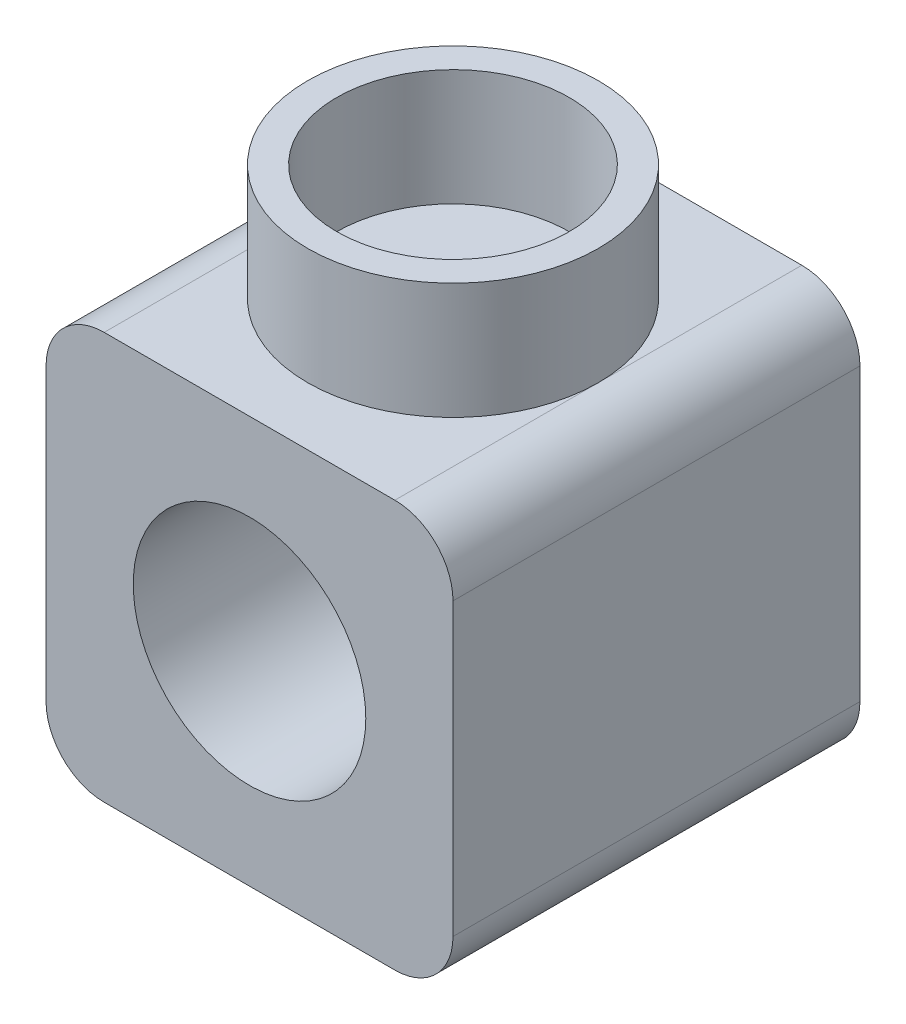
ISO-10303-21;
HEADER;
FILE_DESCRIPTION(('STEP AP214'),'2;1');
FILE_NAME('part.step','',(''),(''),'','','');
FILE_SCHEMA(('AUTOMOTIVE_DESIGN { 1 0 10303 214 1 1 1 1 }'));
ENDSEC;
DATA;
#1=APPLICATION_CONTEXT('core data for automotive mechanical design processes');
#2=APPLICATION_PROTOCOL_DEFINITION('international standard','automotive_design',2000,#1);
#3=PRODUCT_CONTEXT('',#1,'mechanical');
#4=PRODUCT('Part','Part','',(#3));
#5=PRODUCT_RELATED_PRODUCT_CATEGORY('part','',(#4));
#6=PRODUCT_DEFINITION_FORMATION('','',#4);
#7=PRODUCT_DEFINITION_CONTEXT('part definition',#1,'design');
#8=PRODUCT_DEFINITION('design','',#6,#7);
#9=PRODUCT_DEFINITION_SHAPE('','',#8);
#10=(LENGTH_UNIT() NAMED_UNIT(*) SI_UNIT(.MILLI.,.METRE.));
#11=(NAMED_UNIT(*) PLANE_ANGLE_UNIT() SI_UNIT($,.RADIAN.));
#12=(NAMED_UNIT(*) SI_UNIT($,.STERADIAN.) SOLID_ANGLE_UNIT());
#13=UNCERTAINTY_MEASURE_WITH_UNIT(LENGTH_MEASURE(1.E-05),#10,'distance_accuracy_value','');
#14=(GEOMETRIC_REPRESENTATION_CONTEXT(3) GLOBAL_UNCERTAINTY_ASSIGNED_CONTEXT((#13)) GLOBAL_UNIT_ASSIGNED_CONTEXT((#10,
#11,#12)) REPRESENTATION_CONTEXT('',''));
#15=CARTESIAN_POINT('',(0.,0.,0.));
#16=DIRECTION('',(0.,0.,1.));
#17=DIRECTION('',(1.,0.,0.));
#18=AXIS2_PLACEMENT_3D('',#15,#16,#17);
#19=CARTESIAN_POINT('',(-125.,175.,350.));
#20=DIRECTION('',(0.,-1.,0.));
#21=DIRECTION('',(0.,0.,-1.));
#22=AXIS2_PLACEMENT_3D('',#19,#20,#21);
#23=PLANE('',#22);
#24=CARTESIAN_POINT('',(0.,175.,175.));
#25=DIRECTION('',(0.,1.,0.));
#26=DIRECTION('',(0.,0.,1.));
#27=AXIS2_PLACEMENT_3D('',#24,#25,#26);
#28=CIRCLE('',#27,125.);
#29=CARTESIAN_POINT('',(-125.,175.,175.));
#30=VERTEX_POINT('',#29);
#31=CARTESIAN_POINT('',(125.,175.,175.));
#32=VERTEX_POINT('',#31);
#33=EDGE_CURVE('E134',#30,#32,#28,.T.);
#34=ORIENTED_EDGE('',*,*,#33,.F.);
#35=DIRECTION('',(0.,0.,-1.));
#36=VECTOR('',#35,1.);
#37=CARTESIAN_POINT('',(-125.,175.,350.));
#38=LINE('',#37,#36);
#39=CARTESIAN_POINT('',(-125.,175.,350.));
#40=VERTEX_POINT('',#39);
#41=EDGE_CURVE('E132',#40,#30,#38,.T.);
#42=ORIENTED_EDGE('',*,*,#41,.F.);
#43=DIRECTION('',(-1.,0.,0.));
#44=VECTOR('',#43,1.);
#45=CARTESIAN_POINT('',(-125.,175.,350.));
#46=LINE('',#45,#44);
#47=CARTESIAN_POINT('',(125.,175.,350.));
#48=VERTEX_POINT('',#47);
#49=EDGE_CURVE('E117',#48,#40,#46,.T.);
#50=ORIENTED_EDGE('',*,*,#49,.F.);
#51=DIRECTION('',(0.,0.,-1.));
#52=VECTOR('',#51,1.);
#53=CARTESIAN_POINT('',(125.,175.,350.));
#54=LINE('',#53,#52);
#55=EDGE_CURVE('E168',#48,#32,#54,.T.);
#56=ORIENTED_EDGE('',*,*,#55,.T.);
#57=EDGE_LOOP('',(#34,#42,#50,#56));
#58=FACE_BOUND('',#57,.T.);
#59=ADVANCED_FACE('F39',(#58),#23,.F.);
#60=CARTESIAN_POINT('',(-125.,-125.,350.));
#61=DIRECTION('',(0.,0.,-1.));
#62=DIRECTION('',(-1.,0.,0.));
#63=AXIS2_PLACEMENT_3D('',#60,#61,#62);
#64=PLANE('',#63);
#65=CARTESIAN_POINT('',(-125.,-125.,350.));
#66=DIRECTION('',(0.,0.,1.));
#67=DIRECTION('',(-1.,0.,0.));
#68=AXIS2_PLACEMENT_3D('',#65,#66,#67);
#69=CIRCLE('',#68,50.);
#70=CARTESIAN_POINT('',(-175.,-125.,350.));
#71=VERTEX_POINT('',#70);
#72=CARTESIAN_POINT('',(-125.,-175.,350.));
#73=VERTEX_POINT('',#72);
#74=EDGE_CURVE('E165',#71,#73,#69,.T.);
#75=ORIENTED_EDGE('',*,*,#74,.T.);
#76=DIRECTION('',(1.,0.,0.));
#77=VECTOR('',#76,1.);
#78=CARTESIAN_POINT('',(-125.,-175.,350.));
#79=LINE('',#78,#77);
#80=CARTESIAN_POINT('',(125.,-175.,350.));
#81=VERTEX_POINT('',#80);
#82=EDGE_CURVE('E103',#73,#81,#79,.T.);
#83=ORIENTED_EDGE('',*,*,#82,.T.);
#84=CARTESIAN_POINT('',(125.,-125.,350.));
#85=DIRECTION('',(0.,0.,1.));
#86=DIRECTION('',(-1.,0.,0.));
#87=AXIS2_PLACEMENT_3D('',#84,#85,#86);
#88=CIRCLE('',#87,50.);
#89=CARTESIAN_POINT('',(175.,-125.,350.));
#90=VERTEX_POINT('',#89);
#91=EDGE_CURVE('E181',#81,#90,#88,.T.);
#92=ORIENTED_EDGE('',*,*,#91,.T.);
#93=DIRECTION('',(0.,1.,0.));
#94=VECTOR('',#93,1.);
#95=CARTESIAN_POINT('',(175.,125.,350.));
#96=LINE('',#95,#94);
#97=CARTESIAN_POINT('',(175.,125.,350.));
#98=VERTEX_POINT('',#97);
#99=EDGE_CURVE('E195',#90,#98,#96,.T.);
#100=ORIENTED_EDGE('',*,*,#99,.T.);
#101=CARTESIAN_POINT('',(125.,125.,350.));
#102=DIRECTION('',(0.,0.,1.));
#103=DIRECTION('',(-1.,0.,0.));
#104=AXIS2_PLACEMENT_3D('',#101,#102,#103);
#105=CIRCLE('',#104,50.);
#106=EDGE_CURVE('E125',#98,#48,#105,.T.);
#107=ORIENTED_EDGE('',*,*,#106,.T.);
#108=ORIENTED_EDGE('',*,*,#49,.T.);
#109=CARTESIAN_POINT('',(-125.,125.,350.));
#110=DIRECTION('',(0.,0.,1.));
#111=DIRECTION('',(1.,0.,0.));
#112=AXIS2_PLACEMENT_3D('',#109,#110,#111);
#113=CIRCLE('',#112,50.);
#114=CARTESIAN_POINT('',(-175.,125.,350.));
#115=VERTEX_POINT('',#114);
#116=EDGE_CURVE('E122',#40,#115,#113,.T.);
#117=ORIENTED_EDGE('',*,*,#116,.T.);
#118=DIRECTION('',(0.,-1.,0.));
#119=VECTOR('',#118,1.);
#120=CARTESIAN_POINT('',(-175.,125.,350.));
#121=LINE('',#120,#119);
#122=EDGE_CURVE('E63',#115,#71,#121,.T.);
#123=ORIENTED_EDGE('',*,*,#122,.T.);
#124=EDGE_LOOP('',(#75,#83,#92,#100,#107,#108,#117,#123));
#125=FACE_BOUND('',#124,.T.);
#126=CARTESIAN_POINT('',(0.,0.,350.));
#127=DIRECTION('',(0.,0.,1.));
#128=DIRECTION('',(1.,0.,0.));
#129=AXIS2_PLACEMENT_3D('',#126,#127,#128);
#130=CIRCLE('',#129,100.);
#131=CARTESIAN_POINT('',(100.,0.,350.));
#132=VERTEX_POINT('',#131);
#133=EDGE_CURVE('E150',#132,#132,#130,.T.);
#134=ORIENTED_EDGE('',*,*,#133,.F.);
#135=EDGE_LOOP('',(#134));
#136=FACE_BOUND('',#135,.T.);
#137=ADVANCED_FACE('F119',(#125,#136),#64,.F.);
#138=CARTESIAN_POINT('',(-125.,-125.,0.));
#139=DIRECTION('',(0.,0.,-1.));
#140=DIRECTION('',(-1.,0.,0.));
#141=AXIS2_PLACEMENT_3D('',#138,#139,#140);
#142=PLANE('',#141);
#143=CARTESIAN_POINT('',(-125.,-125.,0.));
#144=DIRECTION('',(0.,0.,1.));
#145=DIRECTION('',(-1.,0.,0.));
#146=AXIS2_PLACEMENT_3D('',#143,#144,#145);
#147=CIRCLE('',#146,50.);
#148=CARTESIAN_POINT('',(-175.,-125.,0.));
#149=VERTEX_POINT('',#148);
#150=CARTESIAN_POINT('',(-125.,-175.,0.));
#151=VERTEX_POINT('',#150);
#152=EDGE_CURVE('E146',#149,#151,#147,.T.);
#153=ORIENTED_EDGE('',*,*,#152,.F.);
#154=DIRECTION('',(0.,-1.,0.));
#155=VECTOR('',#154,1.);
#156=CARTESIAN_POINT('',(-175.,125.,0.));
#157=LINE('',#156,#155);
#158=CARTESIAN_POINT('',(-175.,125.,0.));
#159=VERTEX_POINT('',#158);
#160=EDGE_CURVE('E95',#159,#149,#157,.T.);
#161=ORIENTED_EDGE('',*,*,#160,.F.);
#162=CARTESIAN_POINT('',(-125.,125.,0.));
#163=DIRECTION('',(0.,0.,1.));
#164=DIRECTION('',(1.,0.,0.));
#165=AXIS2_PLACEMENT_3D('',#162,#163,#164);
#166=CIRCLE('',#165,50.);
#167=CARTESIAN_POINT('',(-125.,175.,0.));
#168=VERTEX_POINT('',#167);
#169=EDGE_CURVE('E162',#168,#159,#166,.T.);
#170=ORIENTED_EDGE('',*,*,#169,.F.);
#171=DIRECTION('',(-1.,0.,0.));
#172=VECTOR('',#171,1.);
#173=CARTESIAN_POINT('',(-125.,175.,0.));
#174=LINE('',#173,#172);
#175=CARTESIAN_POINT('',(125.,175.,0.));
#176=VERTEX_POINT('',#175);
#177=EDGE_CURVE('E159',#176,#168,#174,.T.);
#178=ORIENTED_EDGE('',*,*,#177,.F.);
#179=CARTESIAN_POINT('',(125.,125.,0.));
#180=DIRECTION('',(0.,0.,1.));
#181=DIRECTION('',(-1.,0.,0.));
#182=AXIS2_PLACEMENT_3D('',#179,#180,#181);
#183=CIRCLE('',#182,50.);
#184=CARTESIAN_POINT('',(175.,125.,0.));
#185=VERTEX_POINT('',#184);
#186=EDGE_CURVE('E156',#185,#176,#183,.T.);
#187=ORIENTED_EDGE('',*,*,#186,.F.);
#188=DIRECTION('',(0.,1.,0.));
#189=VECTOR('',#188,1.);
#190=CARTESIAN_POINT('',(175.,125.,0.));
#191=LINE('',#190,#189);
#192=CARTESIAN_POINT('',(175.,-125.,0.));
#193=VERTEX_POINT('',#192);
#194=EDGE_CURVE('E154',#193,#185,#191,.T.);
#195=ORIENTED_EDGE('',*,*,#194,.F.);
#196=CARTESIAN_POINT('',(125.,-125.,0.));
#197=DIRECTION('',(0.,0.,1.));
#198=DIRECTION('',(-1.,0.,0.));
#199=AXIS2_PLACEMENT_3D('',#196,#197,#198);
#200=CIRCLE('',#199,50.);
#201=CARTESIAN_POINT('',(125.,-175.,0.));
#202=VERTEX_POINT('',#201);
#203=EDGE_CURVE('E152',#202,#193,#200,.T.);
#204=ORIENTED_EDGE('',*,*,#203,.F.);
#205=DIRECTION('',(1.,0.,0.));
#206=VECTOR('',#205,1.);
#207=CARTESIAN_POINT('',(-125.,-175.,0.));
#208=LINE('',#207,#206);
#209=EDGE_CURVE('E149',#151,#202,#208,.T.);
#210=ORIENTED_EDGE('',*,*,#209,.F.);
#211=EDGE_LOOP('',(#153,#161,#170,#178,#187,#195,#204,#210));
#212=FACE_BOUND('',#211,.T.);
#213=CARTESIAN_POINT('',(0.,0.,0.));
#214=DIRECTION('',(0.,0.,1.));
#215=DIRECTION('',(1.,0.,0.));
#216=AXIS2_PLACEMENT_3D('',#213,#214,#215);
#217=CIRCLE('',#216,100.);
#218=CARTESIAN_POINT('',(100.,0.,0.));
#219=VERTEX_POINT('',#218);
#220=EDGE_CURVE('E201',#219,#219,#217,.T.);
#221=ORIENTED_EDGE('',*,*,#220,.T.);
#222=EDGE_LOOP('',(#221));
#223=FACE_BOUND('',#222,.T.);
#224=ADVANCED_FACE('F185',(#212,#223),#142,.T.);
#225=CARTESIAN_POINT('',(-125.,-125.,350.));
#226=DIRECTION('',(0.,0.,-1.));
#227=DIRECTION('',(-1.,0.,0.));
#228=AXIS2_PLACEMENT_3D('',#225,#226,#227);
#229=CYLINDRICAL_SURFACE('',#228,50.);
#230=ORIENTED_EDGE('',*,*,#152,.T.);
#231=DIRECTION('',(0.,0.,-1.));
#232=VECTOR('',#231,1.);
#233=CARTESIAN_POINT('',(-125.,-175.,350.));
#234=LINE('',#233,#232);
#235=EDGE_CURVE('E11',#73,#151,#234,.T.);
#236=ORIENTED_EDGE('',*,*,#235,.F.);
#237=ORIENTED_EDGE('',*,*,#74,.F.);
#238=DIRECTION('',(0.,0.,-1.));
#239=VECTOR('',#238,1.);
#240=CARTESIAN_POINT('',(-175.,-125.,350.));
#241=LINE('',#240,#239);
#242=EDGE_CURVE('E142',#71,#149,#241,.T.);
#243=ORIENTED_EDGE('',*,*,#242,.T.);
#244=EDGE_LOOP('',(#230,#236,#237,#243));
#245=FACE_BOUND('',#244,.T.);
#246=ADVANCED_FACE('F41',(#245),#229,.T.);
#247=CARTESIAN_POINT('',(-125.,-175.,350.));
#248=DIRECTION('',(0.,1.,0.));
#249=DIRECTION('',(0.,0.,1.));
#250=AXIS2_PLACEMENT_3D('',#247,#248,#249);
#251=PLANE('',#250);
#252=ORIENTED_EDGE('',*,*,#209,.T.);
#253=DIRECTION('',(0.,0.,-1.));
#254=VECTOR('',#253,1.);
#255=CARTESIAN_POINT('',(125.,-175.,350.));
#256=LINE('',#255,#254);
#257=EDGE_CURVE('E47',#81,#202,#256,.T.);
#258=ORIENTED_EDGE('',*,*,#257,.F.);
#259=ORIENTED_EDGE('',*,*,#82,.F.);
#260=ORIENTED_EDGE('',*,*,#235,.T.);
#261=EDGE_LOOP('',(#252,#258,#259,#260));
#262=FACE_BOUND('',#261,.T.);
#263=ADVANCED_FACE('F259',(#262),#251,.F.);
#264=CARTESIAN_POINT('',(125.,-125.,350.));
#265=DIRECTION('',(0.,0.,-1.));
#266=DIRECTION('',(-1.,0.,0.));
#267=AXIS2_PLACEMENT_3D('',#264,#265,#266);
#268=CYLINDRICAL_SURFACE('',#267,50.);
#269=ORIENTED_EDGE('',*,*,#203,.T.);
#270=DIRECTION('',(0.,0.,-1.));
#271=VECTOR('',#270,1.);
#272=CARTESIAN_POINT('',(175.,-125.,350.));
#273=LINE('',#272,#271);
#274=EDGE_CURVE('E173',#90,#193,#273,.T.);
#275=ORIENTED_EDGE('',*,*,#274,.F.);
#276=ORIENTED_EDGE('',*,*,#91,.F.);
#277=ORIENTED_EDGE('',*,*,#257,.T.);
#278=EDGE_LOOP('',(#269,#275,#276,#277));
#279=FACE_BOUND('',#278,.T.);
#280=ADVANCED_FACE('F179',(#279),#268,.T.);
#281=CARTESIAN_POINT('',(175.,125.,350.));
#282=DIRECTION('',(-1.,0.,0.));
#283=DIRECTION('',(0.,-1.,0.));
#284=AXIS2_PLACEMENT_3D('',#281,#282,#283);
#285=PLANE('',#284);
#286=ORIENTED_EDGE('',*,*,#194,.T.);
#287=DIRECTION('',(0.,0.,-1.));
#288=VECTOR('',#287,1.);
#289=CARTESIAN_POINT('',(175.,125.,350.));
#290=LINE('',#289,#288);
#291=EDGE_CURVE('E170',#98,#185,#290,.T.);
#292=ORIENTED_EDGE('',*,*,#291,.F.);
#293=ORIENTED_EDGE('',*,*,#99,.F.);
#294=ORIENTED_EDGE('',*,*,#274,.T.);
#295=EDGE_LOOP('',(#286,#292,#293,#294));
#296=FACE_BOUND('',#295,.T.);
#297=ADVANCED_FACE('F191',(#296),#285,.F.);
#298=CARTESIAN_POINT('',(125.,125.,350.));
#299=DIRECTION('',(0.,0.,-1.));
#300=DIRECTION('',(-1.,0.,0.));
#301=AXIS2_PLACEMENT_3D('',#298,#299,#300);
#302=CYLINDRICAL_SURFACE('',#301,50.);
#303=ORIENTED_EDGE('',*,*,#186,.T.);
#304=EDGE_CURVE('E136',#32,#176,#54,.T.);
#305=ORIENTED_EDGE('',*,*,#304,.F.);
#306=ORIENTED_EDGE('',*,*,#55,.F.);
#307=ORIENTED_EDGE('',*,*,#106,.F.);
#308=ORIENTED_EDGE('',*,*,#291,.T.);
#309=EDGE_LOOP('',(#303,#305,#306,#307,#308));
#310=FACE_BOUND('',#309,.T.);
#311=ADVANCED_FACE('F194',(#310),#302,.T.);
#312=EDGE_CURVE('E54',#32,#30,#28,.T.);
#313=ORIENTED_EDGE('',*,*,#312,.F.);
#314=ORIENTED_EDGE('',*,*,#304,.T.);
#315=ORIENTED_EDGE('',*,*,#177,.T.);
#316=EDGE_CURVE('E137',#30,#168,#38,.T.);
#317=ORIENTED_EDGE('',*,*,#316,.F.);
#318=EDGE_LOOP('',(#313,#314,#315,#317));
#319=FACE_BOUND('',#318,.T.);
#320=ADVANCED_FACE('F237',(#319),#23,.F.);
#321=CARTESIAN_POINT('',(-125.,125.,350.));
#322=DIRECTION('',(0.,0.,-1.));
#323=DIRECTION('',(-1.,0.,0.));
#324=AXIS2_PLACEMENT_3D('',#321,#322,#323);
#325=CYLINDRICAL_SURFACE('',#324,50.);
#326=ORIENTED_EDGE('',*,*,#169,.T.);
#327=DIRECTION('',(0.,0.,-1.));
#328=VECTOR('',#327,1.);
#329=CARTESIAN_POINT('',(-175.,125.,350.));
#330=LINE('',#329,#328);
#331=EDGE_CURVE('E140',#115,#159,#330,.T.);
#332=ORIENTED_EDGE('',*,*,#331,.F.);
#333=ORIENTED_EDGE('',*,*,#116,.F.);
#334=ORIENTED_EDGE('',*,*,#41,.T.);
#335=ORIENTED_EDGE('',*,*,#316,.T.);
#336=EDGE_LOOP('',(#326,#332,#333,#334,#335));
#337=FACE_BOUND('',#336,.T.);
#338=ADVANCED_FACE('F139',(#337),#325,.T.);
#339=CARTESIAN_POINT('',(-175.,125.,350.));
#340=DIRECTION('',(1.,0.,0.));
#341=DIRECTION('',(0.,1.,0.));
#342=AXIS2_PLACEMENT_3D('',#339,#340,#341);
#343=PLANE('',#342);
#344=ORIENTED_EDGE('',*,*,#160,.T.);
#345=ORIENTED_EDGE('',*,*,#242,.F.);
#346=ORIENTED_EDGE('',*,*,#122,.F.);
#347=ORIENTED_EDGE('',*,*,#331,.T.);
#348=EDGE_LOOP('',(#344,#345,#346,#347));
#349=FACE_BOUND('',#348,.T.);
#350=ADVANCED_FACE('F252',(#349),#343,.F.);
#351=CARTESIAN_POINT('',(0.,0.,350.));
#352=DIRECTION('',(0.,0.,-1.));
#353=DIRECTION('',(-1.,0.,0.));
#354=AXIS2_PLACEMENT_3D('',#351,#352,#353);
#355=CYLINDRICAL_SURFACE('',#354,100.);
#356=ORIENTED_EDGE('',*,*,#133,.T.);
#357=EDGE_LOOP('',(#356));
#358=FACE_BOUND('',#357,.T.);
#359=ORIENTED_EDGE('',*,*,#220,.F.);
#360=EDGE_LOOP('',(#359));
#361=FACE_BOUND('',#360,.T.);
#362=ADVANCED_FACE('F230',(#358,#361),#355,.F.);
#363=CARTESIAN_POINT('',(0.,275.,175.));
#364=DIRECTION('',(0.,1.,0.));
#365=DIRECTION('',(0.,0.,1.));
#366=AXIS2_PLACEMENT_3D('',#363,#364,#365);
#367=PLANE('',#366);
#368=CARTESIAN_POINT('',(0.,275.,175.));
#369=DIRECTION('',(0.,1.,0.));
#370=DIRECTION('',(0.,0.,1.));
#371=AXIS2_PLACEMENT_3D('',#368,#369,#370);
#372=CIRCLE('',#371,125.);
#373=CARTESIAN_POINT('',(0.,275.,300.));
#374=VERTEX_POINT('',#373);
#375=EDGE_CURVE('E204',#374,#374,#372,.T.);
#376=ORIENTED_EDGE('',*,*,#375,.T.);
#377=EDGE_LOOP('',(#376));
#378=FACE_BOUND('',#377,.T.);
#379=CARTESIAN_POINT('',(0.,275.,175.));
#380=DIRECTION('',(0.,1.,0.));
#381=DIRECTION('',(0.,0.,1.));
#382=AXIS2_PLACEMENT_3D('',#379,#380,#381);
#383=CIRCLE('',#382,100.);
#384=CARTESIAN_POINT('',(0.,275.,275.));
#385=VERTEX_POINT('',#384);
#386=EDGE_CURVE('E213',#385,#385,#383,.T.);
#387=ORIENTED_EDGE('',*,*,#386,.F.);
#388=EDGE_LOOP('',(#387));
#389=FACE_BOUND('',#388,.T.);
#390=ADVANCED_FACE('F221',(#378,#389),#367,.T.);
#391=CARTESIAN_POINT('',(0.,275.,175.));
#392=DIRECTION('',(0.,-1.,0.));
#393=DIRECTION('',(0.,0.,-1.));
#394=AXIS2_PLACEMENT_3D('',#391,#392,#393);
#395=CYLINDRICAL_SURFACE('',#394,125.);
#396=ORIENTED_EDGE('',*,*,#375,.F.);
#397=EDGE_LOOP('',(#396));
#398=FACE_BOUND('',#397,.T.);
#399=ORIENTED_EDGE('',*,*,#312,.T.);
#400=ORIENTED_EDGE('',*,*,#33,.T.);
#401=EDGE_LOOP('',(#399,#400));
#402=FACE_BOUND('',#401,.T.);
#403=ADVANCED_FACE('F218',(#398,#402),#395,.T.);
#404=CARTESIAN_POINT('',(0.,275.,175.));
#405=DIRECTION('',(0.,-1.,0.));
#406=DIRECTION('',(0.,0.,-1.));
#407=AXIS2_PLACEMENT_3D('',#404,#405,#406);
#408=CYLINDRICAL_SURFACE('',#407,100.);
#409=ORIENTED_EDGE('',*,*,#386,.T.);
#410=EDGE_LOOP('',(#409));
#411=FACE_BOUND('',#410,.T.);
#412=CARTESIAN_POINT('',(0.,175.,175.));
#413=DIRECTION('',(0.,1.,0.));
#414=DIRECTION('',(0.,0.,1.));
#415=AXIS2_PLACEMENT_3D('',#412,#413,#414);
#416=CIRCLE('',#415,100.);
#417=CARTESIAN_POINT('',(0.,175.,275.));
#418=VERTEX_POINT('',#417);
#419=EDGE_CURVE('E210',#418,#418,#416,.T.);
#420=ORIENTED_EDGE('',*,*,#419,.F.);
#421=EDGE_LOOP('',(#420));
#422=FACE_BOUND('',#421,.T.);
#423=ADVANCED_FACE('F220',(#411,#422),#408,.F.);
#424=ORIENTED_EDGE('',*,*,#419,.T.);
#425=EDGE_LOOP('',(#424));
#426=FACE_BOUND('',#425,.T.);
#427=ADVANCED_FACE('F228',(#426),#23,.F.);
#428=CLOSED_SHELL('',(#59,#137,#224,#246,#263,#280,#297,#311,#320,#338,#350,#362,#390,#403,#423,#427));
#429=MANIFOLD_SOLID_BREP('B2',#428);
#430=ADVANCED_BREP_SHAPE_REPRESENTATION('',(#18,#429),#14);
#431=SHAPE_DEFINITION_REPRESENTATION(#9,#430);
ENDSEC;
END-ISO-10303-21;
